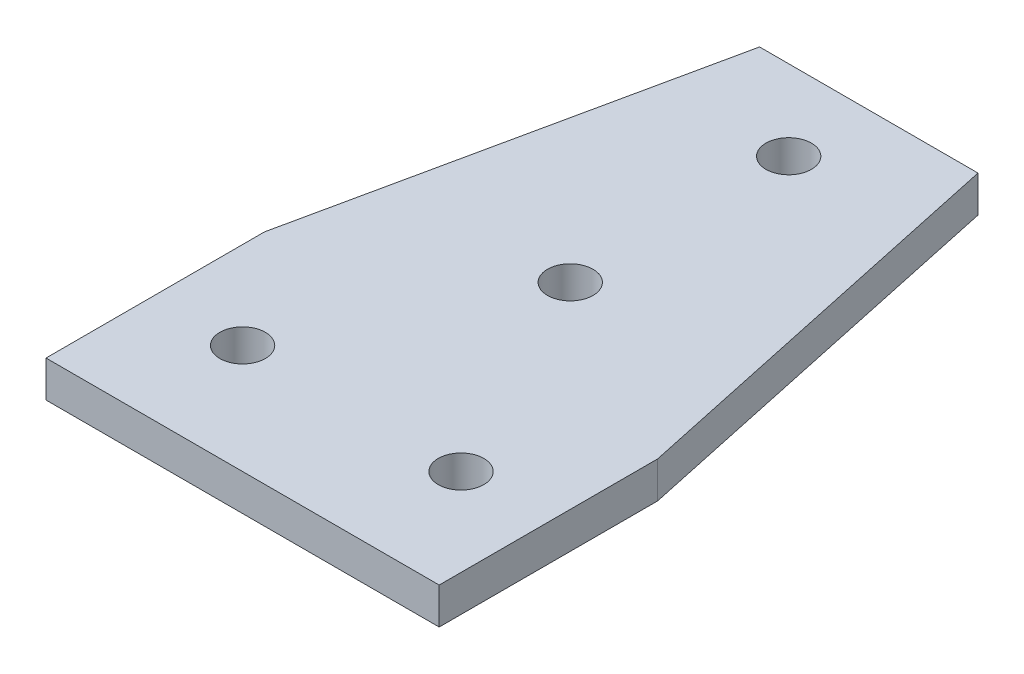
ISO-10303-21;
HEADER;
FILE_DESCRIPTION(('STEP AP214'),'2;1');
FILE_NAME('part.step','',(''),(''),'','','');
FILE_SCHEMA(('AUTOMOTIVE_DESIGN { 1 0 10303 214 1 1 1 1 }'));
ENDSEC;
DATA;
#1=APPLICATION_CONTEXT('core data for automotive mechanical design processes');
#2=APPLICATION_PROTOCOL_DEFINITION('international standard','automotive_design',2000,#1);
#3=PRODUCT_CONTEXT('',#1,'mechanical');
#4=PRODUCT('Part','Part','',(#3));
#5=PRODUCT_RELATED_PRODUCT_CATEGORY('part','',(#4));
#6=PRODUCT_DEFINITION_FORMATION('','',#4);
#7=PRODUCT_DEFINITION_CONTEXT('part definition',#1,'design');
#8=PRODUCT_DEFINITION('design','',#6,#7);
#9=PRODUCT_DEFINITION_SHAPE('','',#8);
#10=(LENGTH_UNIT() NAMED_UNIT(*) SI_UNIT(.MILLI.,.METRE.));
#11=(NAMED_UNIT(*) PLANE_ANGLE_UNIT() SI_UNIT($,.RADIAN.));
#12=(NAMED_UNIT(*) SI_UNIT($,.STERADIAN.) SOLID_ANGLE_UNIT());
#13=UNCERTAINTY_MEASURE_WITH_UNIT(LENGTH_MEASURE(1.E-05),#10,'distance_accuracy_value','');
#14=(GEOMETRIC_REPRESENTATION_CONTEXT(3) GLOBAL_UNCERTAINTY_ASSIGNED_CONTEXT((#13)) GLOBAL_UNIT_ASSIGNED_CONTEXT((#10,
#11,#12)) REPRESENTATION_CONTEXT('',''));
#15=CARTESIAN_POINT('',(0.,0.,0.));
#16=DIRECTION('',(0.,0.,1.));
#17=DIRECTION('',(1.,0.,0.));
#18=AXIS2_PLACEMENT_3D('',#15,#16,#17);
#19=CARTESIAN_POINT('',(0.,6.35,0.));
#20=DIRECTION('',(0.,-1.,0.));
#21=DIRECTION('',(0.,0.,-1.));
#22=AXIS2_PLACEMENT_3D('',#19,#20,#21);
#23=PLANE('',#22);
#24=CARTESIAN_POINT('',(0.,6.35,-76.2));
#25=DIRECTION('',(0.,1.,0.));
#26=DIRECTION('',(0.,0.,1.));
#27=AXIS2_PLACEMENT_3D('',#24,#25,#26);
#28=CIRCLE('',#27,3.96875);
#29=CARTESIAN_POINT('',(0.,6.35,-72.23125));
#30=VERTEX_POINT('',#29);
#31=EDGE_CURVE('E192',#30,#30,#28,.T.);
#32=ORIENTED_EDGE('',*,*,#31,.F.);
#33=EDGE_LOOP('',(#32));
#34=FACE_BOUND('',#33,.T.);
#35=CARTESIAN_POINT('',(-19.05,6.35,0.));
#36=DIRECTION('',(0.,1.,0.));
#37=DIRECTION('',(0.,0.,1.));
#38=AXIS2_PLACEMENT_3D('',#35,#36,#37);
#39=CIRCLE('',#38,3.96875);
#40=CARTESIAN_POINT('',(-19.05,6.35,3.96875));
#41=VERTEX_POINT('',#40);
#42=EDGE_CURVE('E124',#41,#41,#39,.T.);
#43=ORIENTED_EDGE('',*,*,#42,.F.);
#44=EDGE_LOOP('',(#43));
#45=FACE_BOUND('',#44,.T.);
#46=DIRECTION('',(-0.209529088730873,0.,0.977802414077409));
#47=VECTOR('',#46,1.);
#48=CARTESIAN_POINT('',(-34.29,6.35,-19.05));
#49=LINE('',#48,#47);
#50=CARTESIAN_POINT('',(-19.05,6.35,-90.17));
#51=VERTEX_POINT('',#50);
#52=CARTESIAN_POINT('',(-34.29,6.35,-19.05));
#53=VERTEX_POINT('',#52);
#54=EDGE_CURVE('E131',#51,#53,#49,.T.);
#55=ORIENTED_EDGE('',*,*,#54,.T.);
#56=DIRECTION('',(0.,0.,1.));
#57=VECTOR('',#56,1.);
#58=CARTESIAN_POINT('',(-34.29,6.35,-19.05));
#59=LINE('',#58,#57);
#60=CARTESIAN_POINT('',(-34.29,6.35,19.05));
#61=VERTEX_POINT('',#60);
#62=EDGE_CURVE('E89',#53,#61,#59,.T.);
#63=ORIENTED_EDGE('',*,*,#62,.T.);
#64=DIRECTION('',(1.,0.,0.));
#65=VECTOR('',#64,1.);
#66=CARTESIAN_POINT('',(-34.29,6.35,19.05));
#67=LINE('',#66,#65);
#68=CARTESIAN_POINT('',(34.29,6.35,19.05));
#69=VERTEX_POINT('',#68);
#70=EDGE_CURVE('E102',#61,#69,#67,.T.);
#71=ORIENTED_EDGE('',*,*,#70,.T.);
#72=DIRECTION('',(0.,0.,-1.));
#73=VECTOR('',#72,1.);
#74=CARTESIAN_POINT('',(34.29,6.35,19.05));
#75=LINE('',#74,#73);
#76=CARTESIAN_POINT('',(34.29,6.35,-19.05));
#77=VERTEX_POINT('',#76);
#78=EDGE_CURVE('E96',#69,#77,#75,.T.);
#79=ORIENTED_EDGE('',*,*,#78,.T.);
#80=DIRECTION('',(-0.209529088730873,0.,-0.977802414077409));
#81=VECTOR('',#80,1.);
#82=CARTESIAN_POINT('',(19.05,6.35,-90.17));
#83=LINE('',#82,#81);
#84=CARTESIAN_POINT('',(19.05,6.35,-90.17));
#85=VERTEX_POINT('',#84);
#86=EDGE_CURVE('E100',#77,#85,#83,.T.);
#87=ORIENTED_EDGE('',*,*,#86,.T.);
#88=DIRECTION('',(-1.,0.,0.));
#89=VECTOR('',#88,1.);
#90=CARTESIAN_POINT('',(-19.05,6.35,-90.17));
#91=LINE('',#90,#89);
#92=EDGE_CURVE('E52',#85,#51,#91,.T.);
#93=ORIENTED_EDGE('',*,*,#92,.T.);
#94=EDGE_LOOP('',(#55,#63,#71,#79,#87,#93));
#95=FACE_BOUND('',#94,.T.);
#96=CARTESIAN_POINT('',(19.05,6.35,0.));
#97=DIRECTION('',(0.,1.,0.));
#98=DIRECTION('',(0.,0.,1.));
#99=AXIS2_PLACEMENT_3D('',#96,#97,#98);
#100=CIRCLE('',#99,3.96874999999999);
#101=CARTESIAN_POINT('',(19.05,6.35,3.96874999999999));
#102=VERTEX_POINT('',#101);
#103=EDGE_CURVE('E198',#102,#102,#100,.T.);
#104=ORIENTED_EDGE('',*,*,#103,.F.);
#105=EDGE_LOOP('',(#104));
#106=FACE_BOUND('',#105,.T.);
#107=CARTESIAN_POINT('',(0.,6.35,-38.1));
#108=DIRECTION('',(0.,1.,0.));
#109=DIRECTION('',(0.,0.,1.));
#110=AXIS2_PLACEMENT_3D('',#107,#108,#109);
#111=CIRCLE('',#110,3.96875);
#112=CARTESIAN_POINT('',(0.,6.35,-34.13125));
#113=VERTEX_POINT('',#112);
#114=EDGE_CURVE('E183',#113,#113,#111,.T.);
#115=ORIENTED_EDGE('',*,*,#114,.F.);
#116=EDGE_LOOP('',(#115));
#117=FACE_BOUND('',#116,.T.);
#118=ADVANCED_FACE('F35',(#34,#45,#95,#106,#117),#23,.F.);
#119=CARTESIAN_POINT('',(0.,0.,0.));
#120=DIRECTION('',(0.,-1.,0.));
#121=DIRECTION('',(0.,0.,-1.));
#122=AXIS2_PLACEMENT_3D('',#119,#120,#121);
#123=PLANE('',#122);
#124=CARTESIAN_POINT('',(0.,0.,-76.2));
#125=DIRECTION('',(0.,1.,0.));
#126=DIRECTION('',(0.,0.,1.));
#127=AXIS2_PLACEMENT_3D('',#124,#125,#126);
#128=CIRCLE('',#127,3.96875);
#129=CARTESIAN_POINT('',(0.,0.,-72.23125));
#130=VERTEX_POINT('',#129);
#131=EDGE_CURVE('E189',#130,#130,#128,.T.);
#132=ORIENTED_EDGE('',*,*,#131,.T.);
#133=EDGE_LOOP('',(#132));
#134=FACE_BOUND('',#133,.T.);
#135=CARTESIAN_POINT('',(-19.05,0.,0.));
#136=DIRECTION('',(0.,1.,0.));
#137=DIRECTION('',(0.,0.,1.));
#138=AXIS2_PLACEMENT_3D('',#135,#136,#137);
#139=CIRCLE('',#138,3.96875);
#140=CARTESIAN_POINT('',(-19.05,0.,3.96875));
#141=VERTEX_POINT('',#140);
#142=EDGE_CURVE('E201',#141,#141,#139,.T.);
#143=ORIENTED_EDGE('',*,*,#142,.T.);
#144=EDGE_LOOP('',(#143));
#145=FACE_BOUND('',#144,.T.);
#146=DIRECTION('',(-0.209529088730873,0.,0.977802414077409));
#147=VECTOR('',#146,1.);
#148=CARTESIAN_POINT('',(-34.29,0.,-19.05));
#149=LINE('',#148,#147);
#150=CARTESIAN_POINT('',(-19.05,0.,-90.17));
#151=VERTEX_POINT('',#150);
#152=CARTESIAN_POINT('',(-34.29,0.,-19.05));
#153=VERTEX_POINT('',#152);
#154=EDGE_CURVE('E120',#151,#153,#149,.T.);
#155=ORIENTED_EDGE('',*,*,#154,.F.);
#156=DIRECTION('',(-1.,0.,0.));
#157=VECTOR('',#156,1.);
#158=CARTESIAN_POINT('',(-19.05,0.,-90.17));
#159=LINE('',#158,#157);
#160=CARTESIAN_POINT('',(19.05,0.,-90.17));
#161=VERTEX_POINT('',#160);
#162=EDGE_CURVE('E81',#161,#151,#159,.T.);
#163=ORIENTED_EDGE('',*,*,#162,.F.);
#164=DIRECTION('',(-0.209529088730873,0.,-0.977802414077409));
#165=VECTOR('',#164,1.);
#166=CARTESIAN_POINT('',(19.05,0.,-90.17));
#167=LINE('',#166,#165);
#168=CARTESIAN_POINT('',(34.29,0.,-19.05));
#169=VERTEX_POINT('',#168);
#170=EDGE_CURVE('E75',#169,#161,#167,.T.);
#171=ORIENTED_EDGE('',*,*,#170,.F.);
#172=DIRECTION('',(0.,0.,-1.));
#173=VECTOR('',#172,1.);
#174=CARTESIAN_POINT('',(34.29,0.,19.05));
#175=LINE('',#174,#173);
#176=CARTESIAN_POINT('',(34.29,0.,19.05));
#177=VERTEX_POINT('',#176);
#178=EDGE_CURVE('E110',#177,#169,#175,.T.);
#179=ORIENTED_EDGE('',*,*,#178,.F.);
#180=DIRECTION('',(1.,0.,0.));
#181=VECTOR('',#180,1.);
#182=CARTESIAN_POINT('',(-34.29,0.,19.05));
#183=LINE('',#182,#181);
#184=CARTESIAN_POINT('',(-34.29,0.,19.05));
#185=VERTEX_POINT('',#184);
#186=EDGE_CURVE('E126',#185,#177,#183,.T.);
#187=ORIENTED_EDGE('',*,*,#186,.F.);
#188=DIRECTION('',(0.,0.,1.));
#189=VECTOR('',#188,1.);
#190=CARTESIAN_POINT('',(-34.29,0.,-19.05));
#191=LINE('',#190,#189);
#192=EDGE_CURVE('E123',#153,#185,#191,.T.);
#193=ORIENTED_EDGE('',*,*,#192,.F.);
#194=EDGE_LOOP('',(#155,#163,#171,#179,#187,#193));
#195=FACE_BOUND('',#194,.T.);
#196=CARTESIAN_POINT('',(19.05,0.,0.));
#197=DIRECTION('',(0.,1.,0.));
#198=DIRECTION('',(0.,0.,1.));
#199=AXIS2_PLACEMENT_3D('',#196,#197,#198);
#200=CIRCLE('',#199,3.96874999999999);
#201=CARTESIAN_POINT('',(19.05,0.,3.96874999999999));
#202=VERTEX_POINT('',#201);
#203=EDGE_CURVE('E195',#202,#202,#200,.T.);
#204=ORIENTED_EDGE('',*,*,#203,.T.);
#205=EDGE_LOOP('',(#204));
#206=FACE_BOUND('',#205,.T.);
#207=CARTESIAN_POINT('',(0.,0.,-38.1));
#208=DIRECTION('',(0.,1.,0.));
#209=DIRECTION('',(0.,0.,1.));
#210=AXIS2_PLACEMENT_3D('',#207,#208,#209);
#211=CIRCLE('',#210,3.96875);
#212=CARTESIAN_POINT('',(0.,0.,-34.13125));
#213=VERTEX_POINT('',#212);
#214=EDGE_CURVE('E186',#213,#213,#211,.T.);
#215=ORIENTED_EDGE('',*,*,#214,.T.);
#216=EDGE_LOOP('',(#215));
#217=FACE_BOUND('',#216,.T.);
#218=ADVANCED_FACE('F140',(#134,#145,#195,#206,#217),#123,.T.);
#219=CARTESIAN_POINT('',(-34.29,6.35,-19.05));
#220=DIRECTION('',(0.97780241407741,0.,0.209529088730873));
#221=DIRECTION('',(0.209529088730873,0.,-0.97780241407741));
#222=AXIS2_PLACEMENT_3D('',#219,#220,#221);
#223=PLANE('',#222);
#224=ORIENTED_EDGE('',*,*,#154,.T.);
#225=DIRECTION('',(0.,-1.,0.));
#226=VECTOR('',#225,1.);
#227=CARTESIAN_POINT('',(-34.29,6.35,-19.05));
#228=LINE('',#227,#226);
#229=EDGE_CURVE('E11',#53,#153,#228,.T.);
#230=ORIENTED_EDGE('',*,*,#229,.F.);
#231=ORIENTED_EDGE('',*,*,#54,.F.);
#232=DIRECTION('',(0.,-1.,0.));
#233=VECTOR('',#232,1.);
#234=CARTESIAN_POINT('',(-19.05,6.35,-90.17));
#235=LINE('',#234,#233);
#236=EDGE_CURVE('E116',#51,#151,#235,.T.);
#237=ORIENTED_EDGE('',*,*,#236,.T.);
#238=EDGE_LOOP('',(#224,#230,#231,#237));
#239=FACE_BOUND('',#238,.T.);
#240=ADVANCED_FACE('F37',(#239),#223,.F.);
#241=CARTESIAN_POINT('',(-34.29,6.35,-19.05));
#242=DIRECTION('',(1.,0.,0.));
#243=DIRECTION('',(0.,0.,-1.));
#244=AXIS2_PLACEMENT_3D('',#241,#242,#243);
#245=PLANE('',#244);
#246=ORIENTED_EDGE('',*,*,#192,.T.);
#247=DIRECTION('',(0.,-1.,0.));
#248=VECTOR('',#247,1.);
#249=CARTESIAN_POINT('',(-34.29,6.35,19.05));
#250=LINE('',#249,#248);
#251=EDGE_CURVE('E44',#61,#185,#250,.T.);
#252=ORIENTED_EDGE('',*,*,#251,.F.);
#253=ORIENTED_EDGE('',*,*,#62,.F.);
#254=ORIENTED_EDGE('',*,*,#229,.T.);
#255=EDGE_LOOP('',(#246,#252,#253,#254));
#256=FACE_BOUND('',#255,.T.);
#257=ADVANCED_FACE('F258',(#256),#245,.F.);
#258=CARTESIAN_POINT('',(-34.29,6.35,19.05));
#259=DIRECTION('',(0.,0.,-1.));
#260=DIRECTION('',(-1.,0.,0.));
#261=AXIS2_PLACEMENT_3D('',#258,#259,#260);
#262=PLANE('',#261);
#263=ORIENTED_EDGE('',*,*,#186,.T.);
#264=DIRECTION('',(0.,-1.,0.));
#265=VECTOR('',#264,1.);
#266=CARTESIAN_POINT('',(34.29,6.35,19.05));
#267=LINE('',#266,#265);
#268=EDGE_CURVE('E111',#69,#177,#267,.T.);
#269=ORIENTED_EDGE('',*,*,#268,.F.);
#270=ORIENTED_EDGE('',*,*,#70,.F.);
#271=ORIENTED_EDGE('',*,*,#251,.T.);
#272=EDGE_LOOP('',(#263,#269,#270,#271));
#273=FACE_BOUND('',#272,.T.);
#274=ADVANCED_FACE('F137',(#273),#262,.F.);
#275=CARTESIAN_POINT('',(34.29,6.35,19.05));
#276=DIRECTION('',(-1.,0.,0.));
#277=DIRECTION('',(0.,0.,1.));
#278=AXIS2_PLACEMENT_3D('',#275,#276,#277);
#279=PLANE('',#278);
#280=ORIENTED_EDGE('',*,*,#178,.T.);
#281=DIRECTION('',(0.,-1.,0.));
#282=VECTOR('',#281,1.);
#283=CARTESIAN_POINT('',(34.29,6.35,-19.05));
#284=LINE('',#283,#282);
#285=EDGE_CURVE('E107',#77,#169,#284,.T.);
#286=ORIENTED_EDGE('',*,*,#285,.F.);
#287=ORIENTED_EDGE('',*,*,#78,.F.);
#288=ORIENTED_EDGE('',*,*,#268,.T.);
#289=EDGE_LOOP('',(#280,#286,#287,#288));
#290=FACE_BOUND('',#289,.T.);
#291=ADVANCED_FACE('F108',(#290),#279,.F.);
#292=CARTESIAN_POINT('',(19.05,6.35,-90.17));
#293=DIRECTION('',(-0.977802414077409,0.,0.209529088730873));
#294=DIRECTION('',(0.209529088730873,0.,0.97780241407741));
#295=AXIS2_PLACEMENT_3D('',#292,#293,#294);
#296=PLANE('',#295);
#297=ORIENTED_EDGE('',*,*,#170,.T.);
#298=DIRECTION('',(0.,-1.,0.));
#299=VECTOR('',#298,1.);
#300=CARTESIAN_POINT('',(19.05,6.35,-90.17));
#301=LINE('',#300,#299);
#302=EDGE_CURVE('E112',#85,#161,#301,.T.);
#303=ORIENTED_EDGE('',*,*,#302,.F.);
#304=ORIENTED_EDGE('',*,*,#86,.F.);
#305=ORIENTED_EDGE('',*,*,#285,.T.);
#306=EDGE_LOOP('',(#297,#303,#304,#305));
#307=FACE_BOUND('',#306,.T.);
#308=ADVANCED_FACE('F114',(#307),#296,.F.);
#309=CARTESIAN_POINT('',(-19.05,6.35,-90.17));
#310=DIRECTION('',(0.,0.,1.));
#311=DIRECTION('',(1.,0.,0.));
#312=AXIS2_PLACEMENT_3D('',#309,#310,#311);
#313=PLANE('',#312);
#314=ORIENTED_EDGE('',*,*,#162,.T.);
#315=ORIENTED_EDGE('',*,*,#236,.F.);
#316=ORIENTED_EDGE('',*,*,#92,.F.);
#317=ORIENTED_EDGE('',*,*,#302,.T.);
#318=EDGE_LOOP('',(#314,#315,#316,#317));
#319=FACE_BOUND('',#318,.T.);
#320=ADVANCED_FACE('F145',(#319),#313,.F.);
#321=CARTESIAN_POINT('',(-19.05,6.35,0.));
#322=DIRECTION('',(0.,-1.,0.));
#323=DIRECTION('',(0.,0.,-1.));
#324=AXIS2_PLACEMENT_3D('',#321,#322,#323);
#325=CYLINDRICAL_SURFACE('',#324,3.96875);
#326=ORIENTED_EDGE('',*,*,#42,.T.);
#327=EDGE_LOOP('',(#326));
#328=FACE_BOUND('',#327,.T.);
#329=ORIENTED_EDGE('',*,*,#142,.F.);
#330=EDGE_LOOP('',(#329));
#331=FACE_BOUND('',#330,.T.);
#332=ADVANCED_FACE('F147',(#328,#331),#325,.F.);
#333=CARTESIAN_POINT('',(19.05,6.35,0.));
#334=DIRECTION('',(0.,-1.,0.));
#335=DIRECTION('',(0.,0.,-1.));
#336=AXIS2_PLACEMENT_3D('',#333,#334,#335);
#337=CYLINDRICAL_SURFACE('',#336,3.96874999999999);
#338=ORIENTED_EDGE('',*,*,#103,.T.);
#339=EDGE_LOOP('',(#338));
#340=FACE_BOUND('',#339,.T.);
#341=ORIENTED_EDGE('',*,*,#203,.F.);
#342=EDGE_LOOP('',(#341));
#343=FACE_BOUND('',#342,.T.);
#344=ADVANCED_FACE('F153',(#340,#343),#337,.F.);
#345=CARTESIAN_POINT('',(0.,6.35,-76.2));
#346=DIRECTION('',(0.,-1.,0.));
#347=DIRECTION('',(0.,0.,-1.));
#348=AXIS2_PLACEMENT_3D('',#345,#346,#347);
#349=CYLINDRICAL_SURFACE('',#348,3.96875);
#350=ORIENTED_EDGE('',*,*,#31,.T.);
#351=EDGE_LOOP('',(#350));
#352=FACE_BOUND('',#351,.T.);
#353=ORIENTED_EDGE('',*,*,#131,.F.);
#354=EDGE_LOOP('',(#353));
#355=FACE_BOUND('',#354,.T.);
#356=ADVANCED_FACE('F170',(#352,#355),#349,.F.);
#357=CARTESIAN_POINT('',(0.,6.35,-38.1));
#358=DIRECTION('',(0.,-1.,0.));
#359=DIRECTION('',(0.,0.,-1.));
#360=AXIS2_PLACEMENT_3D('',#357,#358,#359);
#361=CYLINDRICAL_SURFACE('',#360,3.96875);
#362=ORIENTED_EDGE('',*,*,#114,.T.);
#363=EDGE_LOOP('',(#362));
#364=FACE_BOUND('',#363,.T.);
#365=ORIENTED_EDGE('',*,*,#214,.F.);
#366=EDGE_LOOP('',(#365));
#367=FACE_BOUND('',#366,.T.);
#368=ADVANCED_FACE('F174',(#364,#367),#361,.F.);
#369=CLOSED_SHELL('',(#118,#218,#240,#257,#274,#291,#308,#320,#332,#344,#356,#368));
#370=MANIFOLD_SOLID_BREP('B2',#369);
#371=ADVANCED_BREP_SHAPE_REPRESENTATION('',(#18,#370),#14);
#372=SHAPE_DEFINITION_REPRESENTATION(#9,#371);
ENDSEC;
END-ISO-10303-21;
